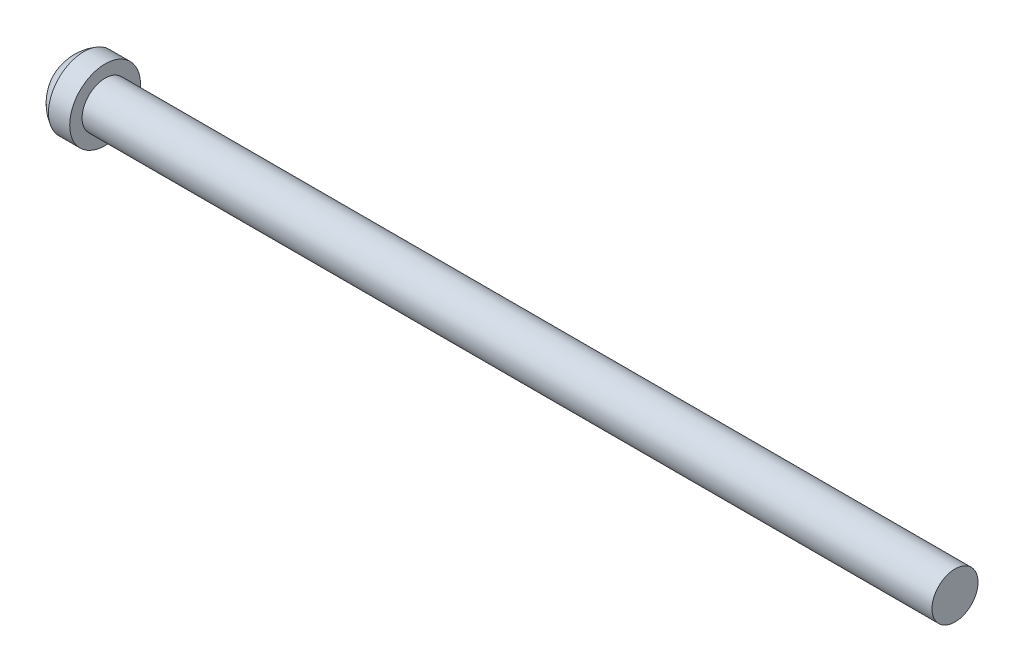
ISO-10303-21;
HEADER;
FILE_DESCRIPTION(('STEP AP214'),'2;1');
FILE_NAME('part.step','',(''),(''),'','','');
FILE_SCHEMA(('AUTOMOTIVE_DESIGN { 1 0 10303 214 1 1 1 1 }'));
ENDSEC;
DATA;
#1=APPLICATION_CONTEXT('core data for automotive mechanical design processes');
#2=APPLICATION_PROTOCOL_DEFINITION('international standard','automotive_design',2000,#1);
#3=PRODUCT_CONTEXT('',#1,'mechanical');
#4=PRODUCT('Part','Part','',(#3));
#5=PRODUCT_RELATED_PRODUCT_CATEGORY('part','',(#4));
#6=PRODUCT_DEFINITION_FORMATION('','',#4);
#7=PRODUCT_DEFINITION_CONTEXT('part definition',#1,'design');
#8=PRODUCT_DEFINITION('design','',#6,#7);
#9=PRODUCT_DEFINITION_SHAPE('','',#8);
#10=(LENGTH_UNIT() NAMED_UNIT(*) SI_UNIT(.MILLI.,.METRE.));
#11=(NAMED_UNIT(*) PLANE_ANGLE_UNIT() SI_UNIT($,.RADIAN.));
#12=(NAMED_UNIT(*) SI_UNIT($,.STERADIAN.) SOLID_ANGLE_UNIT());
#13=UNCERTAINTY_MEASURE_WITH_UNIT(LENGTH_MEASURE(1.E-05),#10,'distance_accuracy_value','');
#14=(GEOMETRIC_REPRESENTATION_CONTEXT(3) GLOBAL_UNCERTAINTY_ASSIGNED_CONTEXT((#13)) GLOBAL_UNIT_ASSIGNED_CONTEXT((#10,
#11,#12)) REPRESENTATION_CONTEXT('',''));
#15=CARTESIAN_POINT('',(0.,0.,0.));
#16=DIRECTION('',(0.,0.,1.));
#17=DIRECTION('',(1.,0.,0.));
#18=AXIS2_PLACEMENT_3D('',#15,#16,#17);
#19=CARTESIAN_POINT('',(0.,-60.,4.99999999999999));
#20=DIRECTION('',(-1.,0.,0.));
#21=DIRECTION('',(0.,0.,1.));
#22=AXIS2_PLACEMENT_3D('',#19,#20,#21);
#23=PLANE('',#22);
#24=CARTESIAN_POINT('',(0.,-60.,4.99999999999999));
#25=DIRECTION('',(-1.,0.,0.));
#26=DIRECTION('',(0.,0.,1.));
#27=AXIS2_PLACEMENT_3D('',#24,#25,#26);
#28=CIRCLE('',#27,3.25000000000001);
#29=CARTESIAN_POINT('',(0.,-60.,8.25));
#30=VERTEX_POINT('',#29);
#31=EDGE_CURVE('E10',#30,#30,#28,.T.);
#32=ORIENTED_EDGE('',*,*,#31,.F.);
#33=EDGE_LOOP('',(#32));
#34=FACE_BOUND('',#33,.T.);
#35=ADVANCED_FACE('F37',(#34),#23,.F.);
#36=CARTESIAN_POINT('',(-120.,-60.,4.99999999999999));
#37=DIRECTION('',(1.,0.,0.));
#38=DIRECTION('',(0.,0.,-1.));
#39=AXIS2_PLACEMENT_3D('',#36,#37,#38);
#40=CYLINDRICAL_SURFACE('',#39,3.25000000000001);
#41=ORIENTED_EDGE('',*,*,#31,.T.);
#42=EDGE_LOOP('',(#41));
#43=FACE_BOUND('',#42,.T.);
#44=CARTESIAN_POINT('',(-120.,-60.,4.99999999999999));
#45=DIRECTION('',(-1.,0.,0.));
#46=DIRECTION('',(0.,0.,1.));
#47=AXIS2_PLACEMENT_3D('',#44,#45,#46);
#48=CIRCLE('',#47,3.25000000000001);
#49=CARTESIAN_POINT('',(-120.,-60.,8.25));
#50=VERTEX_POINT('',#49);
#51=EDGE_CURVE('E45',#50,#50,#48,.T.);
#52=ORIENTED_EDGE('',*,*,#51,.F.);
#53=EDGE_LOOP('',(#52));
#54=FACE_BOUND('',#53,.T.);
#55=ADVANCED_FACE('F61',(#43,#54),#40,.T.);
#56=CARTESIAN_POINT('',(-123.,-60.,4.99999999999999));
#57=DIRECTION('',(1.,0.,0.));
#58=DIRECTION('',(0.,0.,-1.));
#59=AXIS2_PLACEMENT_3D('',#56,#57,#58);
#60=CYLINDRICAL_SURFACE('',#59,4.99999999999999);
#61=CARTESIAN_POINT('',(-123.,-60.,4.99999999999999));
#62=DIRECTION('',(-1.,0.,0.));
#63=DIRECTION('',(0.,0.,1.));
#64=AXIS2_PLACEMENT_3D('',#61,#62,#63);
#65=CIRCLE('',#64,4.99999999999999);
#66=CARTESIAN_POINT('',(-123.,-60.,9.99999999999998));
#67=VERTEX_POINT('',#66);
#68=EDGE_CURVE('E41',#67,#67,#65,.T.);
#69=ORIENTED_EDGE('',*,*,#68,.F.);
#70=EDGE_LOOP('',(#69));
#71=FACE_BOUND('',#70,.T.);
#72=CARTESIAN_POINT('',(-120.,-60.,4.99999999999999));
#73=DIRECTION('',(-1.,0.,0.));
#74=DIRECTION('',(0.,0.,1.));
#75=AXIS2_PLACEMENT_3D('',#72,#73,#74);
#76=CIRCLE('',#75,4.99999999999999);
#77=CARTESIAN_POINT('',(-120.,-60.,9.99999999999998));
#78=VERTEX_POINT('',#77);
#79=EDGE_CURVE('E51',#78,#78,#76,.T.);
#80=ORIENTED_EDGE('',*,*,#79,.T.);
#81=EDGE_LOOP('',(#80));
#82=FACE_BOUND('',#81,.T.);
#83=ADVANCED_FACE('F59',(#71,#82),#60,.T.);
#84=CARTESIAN_POINT('',(-120.333333333333,-60.,4.99999999999999));
#85=DIRECTION('',(0.,0.,1.));
#86=DIRECTION('',(1.,0.,0.));
#87=AXIS2_PLACEMENT_3D('',#84,#85,#86);
#88=SPHERICAL_SURFACE('',#87,5.66666666666665);
#89=CARTESIAN_POINT('',(-120.333333333333,-60.,4.99999999999999));
#90=DIRECTION('',(-1.,0.,0.));
#91=DIRECTION('',(0.,0.,1.));
#92=AXIS2_PLACEMENT_3D('',#89,#90,#91);
#93=SPHERICAL_SURFACE('',#92,5.66666666666665);
#94=ORIENTED_EDGE('',*,*,#68,.T.);
#95=EDGE_LOOP('',(#94));
#96=FACE_BOUND('',#95,.T.);
#97=ADVANCED_FACE('F39',(#96),#93,.T.);
#98=CARTESIAN_POINT('',(-120.,-60.,4.99999999999999));
#99=DIRECTION('',(-1.,0.,0.));
#100=DIRECTION('',(0.,0.,1.));
#101=AXIS2_PLACEMENT_3D('',#98,#99,#100);
#102=PLANE('',#101);
#103=ORIENTED_EDGE('',*,*,#51,.T.);
#104=EDGE_LOOP('',(#103));
#105=FACE_BOUND('',#104,.T.);
#106=ORIENTED_EDGE('',*,*,#79,.F.);
#107=EDGE_LOOP('',(#106));
#108=FACE_BOUND('',#107,.T.);
#109=ADVANCED_FACE('F67',(#105,#108),#102,.F.);
#110=CLOSED_SHELL('',(#35,#55,#83,#97,#109));
#111=MANIFOLD_SOLID_BREP('B2',#110);
#112=ADVANCED_BREP_SHAPE_REPRESENTATION('',(#18,#111),#14);
#113=SHAPE_DEFINITION_REPRESENTATION(#9,#112);
ENDSEC;
END-ISO-10303-21;
